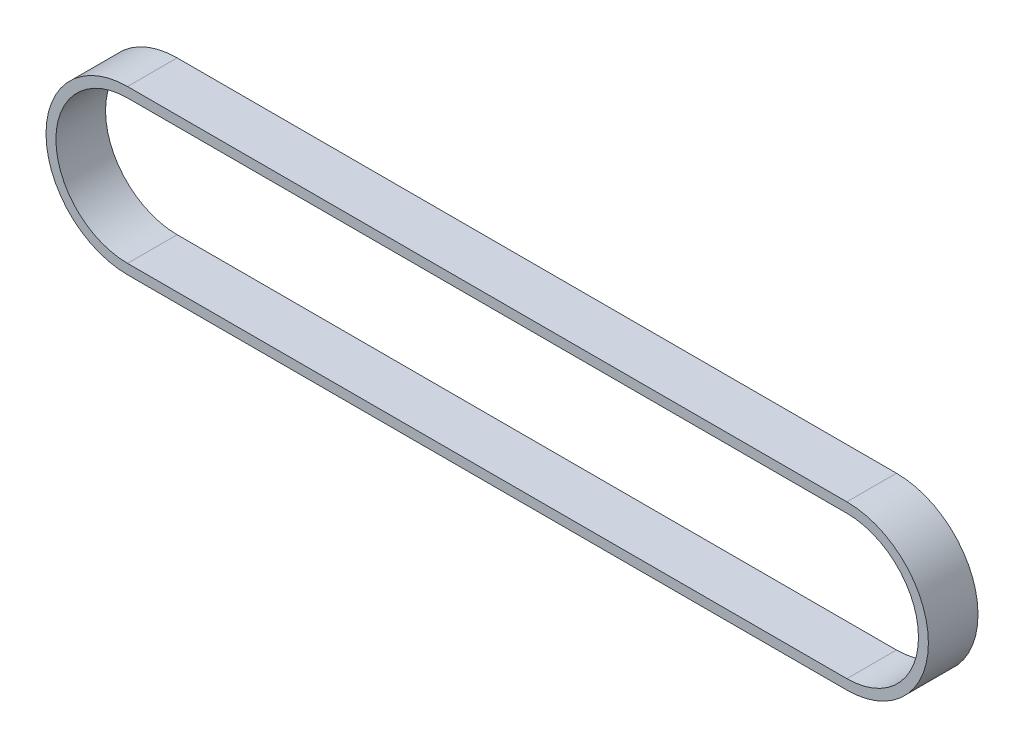
ISO-10303-21;
HEADER;
FILE_DESCRIPTION(('STEP AP214'),'2;1');
FILE_NAME('part.step','',(''),(''),'','','');
FILE_SCHEMA(('AUTOMOTIVE_DESIGN { 1 0 10303 214 1 1 1 1 }'));
ENDSEC;
DATA;
#1=APPLICATION_CONTEXT('core data for automotive mechanical design processes');
#2=APPLICATION_PROTOCOL_DEFINITION('international standard','automotive_design',2000,#1);
#3=PRODUCT_CONTEXT('',#1,'mechanical');
#4=PRODUCT('Part','Part','',(#3));
#5=PRODUCT_RELATED_PRODUCT_CATEGORY('part','',(#4));
#6=PRODUCT_DEFINITION_FORMATION('','',#4);
#7=PRODUCT_DEFINITION_CONTEXT('part definition',#1,'design');
#8=PRODUCT_DEFINITION('design','',#6,#7);
#9=PRODUCT_DEFINITION_SHAPE('','',#8);
#10=(LENGTH_UNIT() NAMED_UNIT(*) SI_UNIT(.MILLI.,.METRE.));
#11=(NAMED_UNIT(*) PLANE_ANGLE_UNIT() SI_UNIT($,.RADIAN.));
#12=(NAMED_UNIT(*) SI_UNIT($,.STERADIAN.) SOLID_ANGLE_UNIT());
#13=UNCERTAINTY_MEASURE_WITH_UNIT(LENGTH_MEASURE(1.E-05),#10,'distance_accuracy_value','');
#14=(GEOMETRIC_REPRESENTATION_CONTEXT(3) GLOBAL_UNCERTAINTY_ASSIGNED_CONTEXT((#13)) GLOBAL_UNIT_ASSIGNED_CONTEXT((#10,
#11,#12)) REPRESENTATION_CONTEXT('',''));
#15=CARTESIAN_POINT('',(0.,0.,0.));
#16=DIRECTION('',(0.,0.,1.));
#17=DIRECTION('',(1.,0.,0.));
#18=AXIS2_PLACEMENT_3D('',#15,#16,#17);
#19=CARTESIAN_POINT('',(0.,-14.435,10.));
#20=DIRECTION('',(0.,0.,-1.));
#21=DIRECTION('',(1.,0.,0.));
#22=AXIS2_PLACEMENT_3D('',#19,#20,#21);
#23=PLANE('',#22);
#24=DIRECTION('',(1.,0.,0.));
#25=VECTOR('',#24,1.);
#26=CARTESIAN_POINT('',(0.,-16.435,10.));
#27=LINE('',#26,#25);
#28=CARTESIAN_POINT('',(-145.,-16.435,10.));
#29=VERTEX_POINT('',#28);
#30=CARTESIAN_POINT('',(0.,-16.435,10.));
#31=VERTEX_POINT('',#30);
#32=EDGE_CURVE('E128',#29,#31,#27,.T.);
#33=ORIENTED_EDGE('',*,*,#32,.T.);
#34=CARTESIAN_POINT('',(0.,0.,10.));
#35=DIRECTION('',(0.,0.,1.));
#36=DIRECTION('',(1.,0.,0.));
#37=AXIS2_PLACEMENT_3D('',#34,#35,#36);
#38=CIRCLE('',#37,16.435);
#39=CARTESIAN_POINT('',(0.,16.435,10.));
#40=VERTEX_POINT('',#39);
#41=EDGE_CURVE('E58',#31,#40,#38,.T.);
#42=ORIENTED_EDGE('',*,*,#41,.T.);
#43=DIRECTION('',(-1.,0.,0.));
#44=VECTOR('',#43,1.);
#45=CARTESIAN_POINT('',(0.,16.435,10.));
#46=LINE('',#45,#44);
#47=CARTESIAN_POINT('',(-145.,16.435,10.));
#48=VERTEX_POINT('',#47);
#49=EDGE_CURVE('E165',#40,#48,#46,.T.);
#50=ORIENTED_EDGE('',*,*,#49,.T.);
#51=CARTESIAN_POINT('',(-145.,0.,10.));
#52=DIRECTION('',(0.,0.,1.));
#53=DIRECTION('',(1.,0.,0.));
#54=AXIS2_PLACEMENT_3D('',#51,#52,#53);
#55=CIRCLE('',#54,16.435);
#56=EDGE_CURVE('E176',#48,#29,#55,.T.);
#57=ORIENTED_EDGE('',*,*,#56,.T.);
#58=EDGE_LOOP('',(#33,#42,#50,#57));
#59=FACE_BOUND('',#58,.T.);
#60=DIRECTION('',(1.,0.,0.));
#61=VECTOR('',#60,1.);
#62=CARTESIAN_POINT('',(0.,-14.435,10.));
#63=LINE('',#62,#61);
#64=CARTESIAN_POINT('',(-145.,-14.435,10.));
#65=VERTEX_POINT('',#64);
#66=CARTESIAN_POINT('',(0.,-14.435,10.));
#67=VERTEX_POINT('',#66);
#68=EDGE_CURVE('E133',#65,#67,#63,.T.);
#69=ORIENTED_EDGE('',*,*,#68,.F.);
#70=CARTESIAN_POINT('',(-145.,0.,10.));
#71=DIRECTION('',(0.,0.,1.));
#72=DIRECTION('',(1.,0.,0.));
#73=AXIS2_PLACEMENT_3D('',#70,#71,#72);
#74=CIRCLE('',#73,14.435);
#75=CARTESIAN_POINT('',(-145.,14.435,10.));
#76=VERTEX_POINT('',#75);
#77=EDGE_CURVE('E117',#76,#65,#74,.T.);
#78=ORIENTED_EDGE('',*,*,#77,.F.);
#79=DIRECTION('',(-1.,0.,0.));
#80=VECTOR('',#79,1.);
#81=CARTESIAN_POINT('',(0.,14.435,10.));
#82=LINE('',#81,#80);
#83=CARTESIAN_POINT('',(0.,14.435,10.));
#84=VERTEX_POINT('',#83);
#85=EDGE_CURVE('E103',#84,#76,#82,.T.);
#86=ORIENTED_EDGE('',*,*,#85,.F.);
#87=CARTESIAN_POINT('',(0.,0.,10.));
#88=DIRECTION('',(0.,0.,1.));
#89=DIRECTION('',(1.,0.,0.));
#90=AXIS2_PLACEMENT_3D('',#87,#88,#89);
#91=CIRCLE('',#90,14.435);
#92=EDGE_CURVE('E116',#67,#84,#91,.T.);
#93=ORIENTED_EDGE('',*,*,#92,.F.);
#94=EDGE_LOOP('',(#69,#78,#86,#93));
#95=FACE_BOUND('',#94,.T.);
#96=ADVANCED_FACE('F47',(#59,#95),#23,.F.);
#97=CARTESIAN_POINT('',(0.,14.435,0.));
#98=DIRECTION('',(0.,0.,-1.));
#99=DIRECTION('',(-1.,0.,0.));
#100=AXIS2_PLACEMENT_3D('',#97,#98,#99);
#101=PLANE('',#100);
#102=DIRECTION('',(-1.,0.,0.));
#103=VECTOR('',#102,1.);
#104=CARTESIAN_POINT('',(0.,16.435,0.));
#105=LINE('',#104,#103);
#106=CARTESIAN_POINT('',(0.,16.435,0.));
#107=VERTEX_POINT('',#106);
#108=CARTESIAN_POINT('',(-145.,16.435,0.));
#109=VERTEX_POINT('',#108);
#110=EDGE_CURVE('E67',#107,#109,#105,.T.);
#111=ORIENTED_EDGE('',*,*,#110,.F.);
#112=CARTESIAN_POINT('',(0.,0.,0.));
#113=DIRECTION('',(0.,0.,1.));
#114=DIRECTION('',(1.,0.,0.));
#115=AXIS2_PLACEMENT_3D('',#112,#113,#114);
#116=CIRCLE('',#115,16.435);
#117=CARTESIAN_POINT('',(0.,-16.435,0.));
#118=VERTEX_POINT('',#117);
#119=EDGE_CURVE('E11',#118,#107,#116,.T.);
#120=ORIENTED_EDGE('',*,*,#119,.F.);
#121=DIRECTION('',(1.,0.,0.));
#122=VECTOR('',#121,1.);
#123=CARTESIAN_POINT('',(0.,-16.435,0.));
#124=LINE('',#123,#122);
#125=CARTESIAN_POINT('',(-145.,-16.435,0.));
#126=VERTEX_POINT('',#125);
#127=EDGE_CURVE('E167',#126,#118,#124,.T.);
#128=ORIENTED_EDGE('',*,*,#127,.F.);
#129=CARTESIAN_POINT('',(-145.,0.,0.));
#130=DIRECTION('',(0.,0.,1.));
#131=DIRECTION('',(1.,0.,0.));
#132=AXIS2_PLACEMENT_3D('',#129,#130,#131);
#133=CIRCLE('',#132,16.435);
#134=EDGE_CURVE('E162',#109,#126,#133,.T.);
#135=ORIENTED_EDGE('',*,*,#134,.F.);
#136=EDGE_LOOP('',(#111,#120,#128,#135));
#137=FACE_BOUND('',#136,.T.);
#138=DIRECTION('',(-1.,0.,0.));
#139=VECTOR('',#138,1.);
#140=CARTESIAN_POINT('',(0.,14.435,0.));
#141=LINE('',#140,#139);
#142=CARTESIAN_POINT('',(0.,14.435,0.));
#143=VERTEX_POINT('',#142);
#144=CARTESIAN_POINT('',(-145.,14.435,0.));
#145=VERTEX_POINT('',#144);
#146=EDGE_CURVE('E106',#143,#145,#141,.T.);
#147=ORIENTED_EDGE('',*,*,#146,.T.);
#148=CARTESIAN_POINT('',(-145.,0.,0.));
#149=DIRECTION('',(0.,0.,1.));
#150=DIRECTION('',(1.,0.,0.));
#151=AXIS2_PLACEMENT_3D('',#148,#149,#150);
#152=CIRCLE('',#151,14.435);
#153=CARTESIAN_POINT('',(-145.,-14.435,0.));
#154=VERTEX_POINT('',#153);
#155=EDGE_CURVE('E119',#145,#154,#152,.T.);
#156=ORIENTED_EDGE('',*,*,#155,.T.);
#157=DIRECTION('',(1.,0.,0.));
#158=VECTOR('',#157,1.);
#159=CARTESIAN_POINT('',(0.,-14.435,0.));
#160=LINE('',#159,#158);
#161=CARTESIAN_POINT('',(0.,-14.435,0.));
#162=VERTEX_POINT('',#161);
#163=EDGE_CURVE('E139',#154,#162,#160,.T.);
#164=ORIENTED_EDGE('',*,*,#163,.T.);
#165=CARTESIAN_POINT('',(0.,0.,0.));
#166=DIRECTION('',(0.,0.,1.));
#167=DIRECTION('',(1.,0.,0.));
#168=AXIS2_PLACEMENT_3D('',#165,#166,#167);
#169=CIRCLE('',#168,14.435);
#170=EDGE_CURVE('E124',#162,#143,#169,.T.);
#171=ORIENTED_EDGE('',*,*,#170,.T.);
#172=EDGE_LOOP('',(#147,#156,#164,#171));
#173=FACE_BOUND('',#172,.T.);
#174=ADVANCED_FACE('F49',(#137,#173),#101,.T.);
#175=CARTESIAN_POINT('',(0.,0.,0.));
#176=DIRECTION('',(0.,0.,1.));
#177=DIRECTION('',(1.,0.,0.));
#178=AXIS2_PLACEMENT_3D('',#175,#176,#177);
#179=CYLINDRICAL_SURFACE('',#178,16.435);
#180=ORIENTED_EDGE('',*,*,#41,.F.);
#181=DIRECTION('',(0.,0.,1.));
#182=VECTOR('',#181,1.);
#183=CARTESIAN_POINT('',(0.,-16.435,0.));
#184=LINE('',#183,#182);
#185=EDGE_CURVE('E170',#118,#31,#184,.T.);
#186=ORIENTED_EDGE('',*,*,#185,.F.);
#187=ORIENTED_EDGE('',*,*,#119,.T.);
#188=DIRECTION('',(0.,0.,1.));
#189=VECTOR('',#188,1.);
#190=CARTESIAN_POINT('',(0.,16.435,0.));
#191=LINE('',#190,#189);
#192=EDGE_CURVE('E161',#107,#40,#191,.T.);
#193=ORIENTED_EDGE('',*,*,#192,.T.);
#194=EDGE_LOOP('',(#180,#186,#187,#193));
#195=FACE_BOUND('',#194,.T.);
#196=ADVANCED_FACE('F207',(#195),#179,.T.);
#197=CARTESIAN_POINT('',(0.,16.435,0.));
#198=DIRECTION('',(0.,1.,0.));
#199=DIRECTION('',(-1.,0.,0.));
#200=AXIS2_PLACEMENT_3D('',#197,#198,#199);
#201=PLANE('',#200);
#202=ORIENTED_EDGE('',*,*,#49,.F.);
#203=ORIENTED_EDGE('',*,*,#192,.F.);
#204=ORIENTED_EDGE('',*,*,#110,.T.);
#205=DIRECTION('',(0.,0.,1.));
#206=VECTOR('',#205,1.);
#207=CARTESIAN_POINT('',(-145.,16.435,0.));
#208=LINE('',#207,#206);
#209=EDGE_CURVE('E166',#109,#48,#208,.T.);
#210=ORIENTED_EDGE('',*,*,#209,.T.);
#211=EDGE_LOOP('',(#202,#203,#204,#210));
#212=FACE_BOUND('',#211,.T.);
#213=ADVANCED_FACE('F222',(#212),#201,.T.);
#214=CARTESIAN_POINT('',(-145.,0.,0.));
#215=DIRECTION('',(0.,0.,1.));
#216=DIRECTION('',(1.,0.,0.));
#217=AXIS2_PLACEMENT_3D('',#214,#215,#216);
#218=CYLINDRICAL_SURFACE('',#217,16.435);
#219=ORIENTED_EDGE('',*,*,#56,.F.);
#220=ORIENTED_EDGE('',*,*,#209,.F.);
#221=ORIENTED_EDGE('',*,*,#134,.T.);
#222=DIRECTION('',(0.,0.,1.));
#223=VECTOR('',#222,1.);
#224=CARTESIAN_POINT('',(-145.,-16.435,0.));
#225=LINE('',#224,#223);
#226=EDGE_CURVE('E171',#126,#29,#225,.T.);
#227=ORIENTED_EDGE('',*,*,#226,.T.);
#228=EDGE_LOOP('',(#219,#220,#221,#227));
#229=FACE_BOUND('',#228,.T.);
#230=ADVANCED_FACE('F219',(#229),#218,.T.);
#231=CARTESIAN_POINT('',(0.,-16.435,0.));
#232=DIRECTION('',(0.,-1.,0.));
#233=DIRECTION('',(1.,0.,0.));
#234=AXIS2_PLACEMENT_3D('',#231,#232,#233);
#235=PLANE('',#234);
#236=ORIENTED_EDGE('',*,*,#32,.F.);
#237=ORIENTED_EDGE('',*,*,#226,.F.);
#238=ORIENTED_EDGE('',*,*,#127,.T.);
#239=ORIENTED_EDGE('',*,*,#185,.T.);
#240=EDGE_LOOP('',(#236,#237,#238,#239));
#241=FACE_BOUND('',#240,.T.);
#242=ADVANCED_FACE('F199',(#241),#235,.T.);
#243=CARTESIAN_POINT('',(0.,0.,0.));
#244=DIRECTION('',(0.,0.,1.));
#245=DIRECTION('',(1.,0.,0.));
#246=AXIS2_PLACEMENT_3D('',#243,#244,#245);
#247=CYLINDRICAL_SURFACE('',#246,14.435);
#248=ORIENTED_EDGE('',*,*,#92,.T.);
#249=DIRECTION('',(0.,0.,1.));
#250=VECTOR('',#249,1.);
#251=CARTESIAN_POINT('',(0.,14.435,0.));
#252=LINE('',#251,#250);
#253=EDGE_CURVE('E100',#143,#84,#252,.T.);
#254=ORIENTED_EDGE('',*,*,#253,.F.);
#255=ORIENTED_EDGE('',*,*,#170,.F.);
#256=DIRECTION('',(0.,0.,1.));
#257=VECTOR('',#256,1.);
#258=CARTESIAN_POINT('',(0.,-14.435,0.));
#259=LINE('',#258,#257);
#260=EDGE_CURVE('E51',#162,#67,#259,.T.);
#261=ORIENTED_EDGE('',*,*,#260,.T.);
#262=EDGE_LOOP('',(#248,#254,#255,#261));
#263=FACE_BOUND('',#262,.T.);
#264=ADVANCED_FACE('F121',(#263),#247,.F.);
#265=CARTESIAN_POINT('',(0.,14.435,0.));
#266=DIRECTION('',(0.,1.,0.));
#267=DIRECTION('',(-1.,0.,0.));
#268=AXIS2_PLACEMENT_3D('',#265,#266,#267);
#269=PLANE('',#268);
#270=ORIENTED_EDGE('',*,*,#85,.T.);
#271=DIRECTION('',(0.,0.,1.));
#272=VECTOR('',#271,1.);
#273=CARTESIAN_POINT('',(-145.,14.435,0.));
#274=LINE('',#273,#272);
#275=EDGE_CURVE('E95',#145,#76,#274,.T.);
#276=ORIENTED_EDGE('',*,*,#275,.F.);
#277=ORIENTED_EDGE('',*,*,#146,.F.);
#278=ORIENTED_EDGE('',*,*,#253,.T.);
#279=EDGE_LOOP('',(#270,#276,#277,#278));
#280=FACE_BOUND('',#279,.T.);
#281=ADVANCED_FACE('F102',(#280),#269,.F.);
#282=CARTESIAN_POINT('',(-145.,0.,0.));
#283=DIRECTION('',(0.,0.,1.));
#284=DIRECTION('',(1.,0.,0.));
#285=AXIS2_PLACEMENT_3D('',#282,#283,#284);
#286=CYLINDRICAL_SURFACE('',#285,14.435);
#287=ORIENTED_EDGE('',*,*,#77,.T.);
#288=DIRECTION('',(0.,0.,1.));
#289=VECTOR('',#288,1.);
#290=CARTESIAN_POINT('',(-145.,-14.435,0.));
#291=LINE('',#290,#289);
#292=EDGE_CURVE('E135',#154,#65,#291,.T.);
#293=ORIENTED_EDGE('',*,*,#292,.F.);
#294=ORIENTED_EDGE('',*,*,#155,.F.);
#295=ORIENTED_EDGE('',*,*,#275,.T.);
#296=EDGE_LOOP('',(#287,#293,#294,#295));
#297=FACE_BOUND('',#296,.T.);
#298=ADVANCED_FACE('F153',(#297),#286,.F.);
#299=CARTESIAN_POINT('',(0.,-14.435,0.));
#300=DIRECTION('',(0.,-1.,0.));
#301=DIRECTION('',(1.,0.,0.));
#302=AXIS2_PLACEMENT_3D('',#299,#300,#301);
#303=PLANE('',#302);
#304=ORIENTED_EDGE('',*,*,#68,.T.);
#305=ORIENTED_EDGE('',*,*,#260,.F.);
#306=ORIENTED_EDGE('',*,*,#163,.F.);
#307=ORIENTED_EDGE('',*,*,#292,.T.);
#308=EDGE_LOOP('',(#304,#305,#306,#307));
#309=FACE_BOUND('',#308,.T.);
#310=ADVANCED_FACE('F154',(#309),#303,.F.);
#311=CLOSED_SHELL('',(#96,#174,#196,#213,#230,#242,#264,#281,#298,#310));
#312=MANIFOLD_SOLID_BREP('B2',#311);
#313=ADVANCED_BREP_SHAPE_REPRESENTATION('',(#18,#312),#14);
#314=SHAPE_DEFINITION_REPRESENTATION(#9,#313);
ENDSEC;
END-ISO-10303-21;
